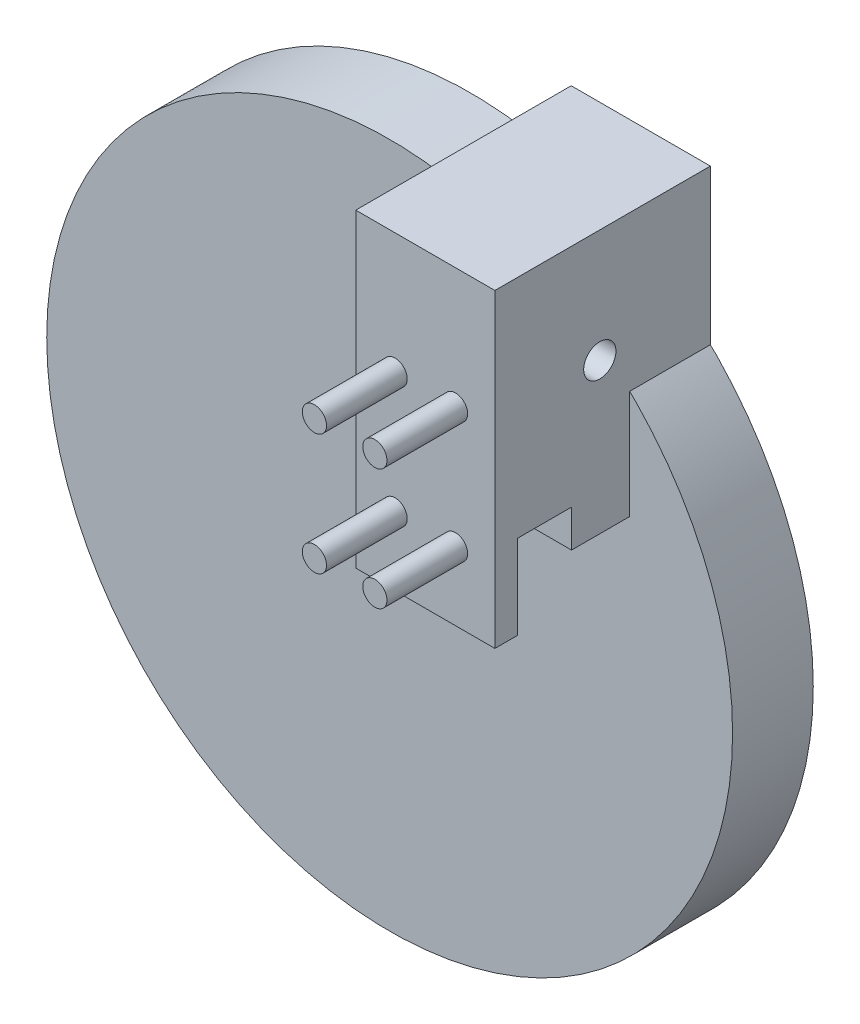
ISO-10303-21;
HEADER;
FILE_DESCRIPTION(('STEP AP214'),'2;1');
FILE_NAME('part.step','',(''),(''),'','','');
FILE_SCHEMA(('AUTOMOTIVE_DESIGN { 1 0 10303 214 1 1 1 1 }'));
ENDSEC;
DATA;
#1=APPLICATION_CONTEXT('core data for automotive mechanical design processes');
#2=APPLICATION_PROTOCOL_DEFINITION('international standard','automotive_design',2000,#1);
#3=PRODUCT_CONTEXT('',#1,'mechanical');
#4=PRODUCT('Part','Part','',(#3));
#5=PRODUCT_RELATED_PRODUCT_CATEGORY('part','',(#4));
#6=PRODUCT_DEFINITION_FORMATION('','',#4);
#7=PRODUCT_DEFINITION_CONTEXT('part definition',#1,'design');
#8=PRODUCT_DEFINITION('design','',#6,#7);
#9=PRODUCT_DEFINITION_SHAPE('','',#8);
#10=(LENGTH_UNIT() NAMED_UNIT(*) SI_UNIT(.MILLI.,.METRE.));
#11=(NAMED_UNIT(*) PLANE_ANGLE_UNIT() SI_UNIT($,.RADIAN.));
#12=(NAMED_UNIT(*) SI_UNIT($,.STERADIAN.) SOLID_ANGLE_UNIT());
#13=UNCERTAINTY_MEASURE_WITH_UNIT(LENGTH_MEASURE(1.E-05),#10,'distance_accuracy_value','');
#14=(GEOMETRIC_REPRESENTATION_CONTEXT(3) GLOBAL_UNCERTAINTY_ASSIGNED_CONTEXT((#13)) GLOBAL_UNIT_ASSIGNED_CONTEXT((#10,
#11,#12)) REPRESENTATION_CONTEXT('',''));
#15=CARTESIAN_POINT('',(0.,0.,0.));
#16=DIRECTION('',(0.,0.,1.));
#17=DIRECTION('',(1.,0.,0.));
#18=AXIS2_PLACEMENT_3D('',#15,#16,#17);
#19=CARTESIAN_POINT('',(12.5,49.5,17.2));
#20=DIRECTION('',(1.,0.,0.));
#21=DIRECTION('',(0.,1.,0.));
#22=AXIS2_PLACEMENT_3D('',#19,#20,#21);
#23=PLANE('',#22);
#24=CARTESIAN_POINT('',(12.5,35.5,13.7));
#25=DIRECTION('',(1.,0.,0.));
#26=DIRECTION('',(0.,1.,0.));
#27=AXIS2_PLACEMENT_3D('',#24,#25,#26);
#28=CIRCLE('',#27,2.);
#29=CARTESIAN_POINT('',(12.5,37.5,13.7));
#30=VERTEX_POINT('',#29);
#31=EDGE_CURVE('E261',#30,#30,#28,.F.);
#32=ORIENTED_EDGE('',*,*,#31,.F.);
#33=EDGE_LOOP('',(#32));
#34=FACE_BOUND('',#33,.T.);
#35=CARTESIAN_POINT('',(12.5,18.7225374558526,7.5));
#36=DIRECTION('',(1.,0.,0.));
#37=DIRECTION('',(0.,1.,0.));
#38=AXIS2_PLACEMENT_3D('',#35,#36,#37);
#39=CIRCLE('',#38,1.5);
#40=CARTESIAN_POINT('',(12.5,20.2225374558526,7.5));
#41=VERTEX_POINT('',#40);
#42=EDGE_CURVE('E271',#41,#41,#39,.T.);
#43=ORIENTED_EDGE('',*,*,#42,.T.);
#44=EDGE_LOOP('',(#43));
#45=FACE_BOUND('',#44,.T.);
#46=DIRECTION('',(0.,-1.,0.));
#47=VECTOR('',#46,1.);
#48=CARTESIAN_POINT('',(12.5,49.5,17.2));
#49=LINE('',#48,#47);
#50=CARTESIAN_POINT('',(12.5,21.5,17.2));
#51=VERTEX_POINT('',#50);
#52=CARTESIAN_POINT('',(12.5,16.882707638593,17.2));
#53=VERTEX_POINT('',#52);
#54=EDGE_CURVE('E265',#51,#53,#49,.T.);
#55=ORIENTED_EDGE('',*,*,#54,.F.);
#56=DIRECTION('',(0.,0.,1.));
#57=VECTOR('',#56,1.);
#58=CARTESIAN_POINT('',(12.5,21.5,17.2));
#59=LINE('',#58,#57);
#60=CARTESIAN_POINT('',(12.5,21.5,23.9));
#61=VERTEX_POINT('',#60);
#62=EDGE_CURVE('E257',#51,#61,#59,.T.);
#63=ORIENTED_EDGE('',*,*,#62,.T.);
#64=DIRECTION('',(0.,1.,0.));
#65=VECTOR('',#64,1.);
#66=CARTESIAN_POINT('',(12.5,0.,23.9));
#67=LINE('',#66,#65);
#68=CARTESIAN_POINT('',(12.5,11.0794908296356,23.9));
#69=VERTEX_POINT('',#68);
#70=EDGE_CURVE('E237',#69,#61,#67,.T.);
#71=ORIENTED_EDGE('',*,*,#70,.F.);
#72=DIRECTION('',(0.,0.,-1.));
#73=VECTOR('',#72,1.);
#74=CARTESIAN_POINT('',(12.5,11.0794908296356,0.));
#75=LINE('',#74,#73);
#76=CARTESIAN_POINT('',(12.5,11.0794908296356,26.7));
#77=VERTEX_POINT('',#76);
#78=EDGE_CURVE('E249',#77,#69,#75,.T.);
#79=ORIENTED_EDGE('',*,*,#78,.F.);
#80=DIRECTION('',(0.,1.,0.));
#81=VECTOR('',#80,1.);
#82=CARTESIAN_POINT('',(12.5,3.67961088834941,26.7));
#83=LINE('',#82,#81);
#84=CARTESIAN_POINT('',(12.5,49.5,26.7));
#85=VERTEX_POINT('',#84);
#86=EDGE_CURVE('E280',#77,#85,#83,.T.);
#87=ORIENTED_EDGE('',*,*,#86,.T.);
#88=DIRECTION('',(0.,0.,-1.));
#89=VECTOR('',#88,1.);
#90=CARTESIAN_POINT('',(12.5,49.5,17.2));
#91=LINE('',#90,#89);
#92=CARTESIAN_POINT('',(12.5,49.5,0.));
#93=VERTEX_POINT('',#92);
#94=EDGE_CURVE('E288',#85,#93,#91,.T.);
#95=ORIENTED_EDGE('',*,*,#94,.T.);
#96=DIRECTION('',(0.,-1.,0.));
#97=VECTOR('',#96,1.);
#98=CARTESIAN_POINT('',(12.5,49.5,0.));
#99=LINE('',#98,#97);
#100=CARTESIAN_POINT('',(12.5,16.882707638593,0.));
#101=VERTEX_POINT('',#100);
#102=EDGE_CURVE('E295',#93,#101,#99,.T.);
#103=ORIENTED_EDGE('',*,*,#102,.T.);
#104=DIRECTION('',(0.,0.,-1.));
#105=VECTOR('',#104,1.);
#106=CARTESIAN_POINT('',(12.5,16.882707638593,22.0126868789232));
#107=LINE('',#106,#105);
#108=EDGE_CURVE('E164',#53,#101,#107,.T.);
#109=ORIENTED_EDGE('',*,*,#108,.F.);
#110=EDGE_LOOP('',(#55,#63,#71,#79,#87,#95,#103,#109));
#111=FACE_BOUND('',#110,.T.);
#112=ADVANCED_FACE('F150',(#34,#45,#111),#23,.F.);
#113=CARTESIAN_POINT('',(29.7428613661026,49.5,17.2));
#114=DIRECTION('',(-1.,0.,0.));
#115=DIRECTION('',(0.,0.,1.));
#116=AXIS2_PLACEMENT_3D('',#113,#114,#115);
#117=PLANE('',#116);
#118=DIRECTION('',(0.,0.,-1.));
#119=VECTOR('',#118,1.);
#120=CARTESIAN_POINT('',(29.7428613661026,21.5,17.2));
#121=LINE('',#120,#119);
#122=CARTESIAN_POINT('',(29.7428613661026,21.5,23.9));
#123=VERTEX_POINT('',#122);
#124=CARTESIAN_POINT('',(29.7428613661026,21.5,17.2));
#125=VERTEX_POINT('',#124);
#126=EDGE_CURVE('E259',#123,#125,#121,.T.);
#127=ORIENTED_EDGE('',*,*,#126,.T.);
#128=DIRECTION('',(0.,1.,0.));
#129=VECTOR('',#128,1.);
#130=CARTESIAN_POINT('',(29.7428613661026,49.5,17.2));
#131=LINE('',#130,#129);
#132=CARTESIAN_POINT('',(29.7428613661026,16.882707638593,17.2));
#133=VERTEX_POINT('',#132);
#134=EDGE_CURVE('E285',#133,#125,#131,.T.);
#135=ORIENTED_EDGE('',*,*,#134,.F.);
#136=DIRECTION('',(0.,0.,1.));
#137=VECTOR('',#136,1.);
#138=CARTESIAN_POINT('',(29.7428613661026,16.882707638593,22.0126868789232));
#139=LINE('',#138,#137);
#140=CARTESIAN_POINT('',(29.7428613661026,16.882707638593,0.));
#141=VERTEX_POINT('',#140);
#142=EDGE_CURVE('E357',#141,#133,#139,.T.);
#143=ORIENTED_EDGE('',*,*,#142,.F.);
#144=DIRECTION('',(0.,1.,0.));
#145=VECTOR('',#144,1.);
#146=CARTESIAN_POINT('',(29.7428613661026,49.5,0.));
#147=LINE('',#146,#145);
#148=CARTESIAN_POINT('',(29.7428613661026,49.5,0.));
#149=VERTEX_POINT('',#148);
#150=EDGE_CURVE('E298',#141,#149,#147,.T.);
#151=ORIENTED_EDGE('',*,*,#150,.T.);
#152=DIRECTION('',(0.,0.,-1.));
#153=VECTOR('',#152,1.);
#154=CARTESIAN_POINT('',(29.7428613661026,49.5,17.2));
#155=LINE('',#154,#153);
#156=CARTESIAN_POINT('',(29.7428613661026,49.5,26.7));
#157=VERTEX_POINT('',#156);
#158=EDGE_CURVE('E305',#157,#149,#155,.T.);
#159=ORIENTED_EDGE('',*,*,#158,.F.);
#160=DIRECTION('',(0.,1.,0.));
#161=VECTOR('',#160,1.);
#162=CARTESIAN_POINT('',(29.7428613661026,3.67961088834941,26.7));
#163=LINE('',#162,#161);
#164=CARTESIAN_POINT('',(29.7428613661026,11.0794908296356,26.7));
#165=VERTEX_POINT('',#164);
#166=EDGE_CURVE('E314',#165,#157,#163,.T.);
#167=ORIENTED_EDGE('',*,*,#166,.F.);
#168=DIRECTION('',(0.,0.,1.));
#169=VECTOR('',#168,1.);
#170=CARTESIAN_POINT('',(29.7428613661026,11.0794908296356,0.));
#171=LINE('',#170,#169);
#172=CARTESIAN_POINT('',(29.7428613661026,11.0794908296356,23.9));
#173=VERTEX_POINT('',#172);
#174=EDGE_CURVE('E395',#173,#165,#171,.T.);
#175=ORIENTED_EDGE('',*,*,#174,.F.);
#176=DIRECTION('',(0.,-1.,0.));
#177=VECTOR('',#176,1.);
#178=CARTESIAN_POINT('',(29.7428613661026,0.,23.9));
#179=LINE('',#178,#177);
#180=EDGE_CURVE('E399',#123,#173,#179,.T.);
#181=ORIENTED_EDGE('',*,*,#180,.F.);
#182=EDGE_LOOP('',(#127,#135,#143,#151,#159,#167,#175,#181));
#183=FACE_BOUND('',#182,.T.);
#184=CARTESIAN_POINT('',(29.7428613661026,35.5,13.7));
#185=DIRECTION('',(1.,0.,0.));
#186=DIRECTION('',(0.,0.,-1.));
#187=AXIS2_PLACEMENT_3D('',#184,#185,#186);
#188=CIRCLE('',#187,2.);
#189=CARTESIAN_POINT('',(29.7428613661026,35.5,11.7));
#190=VERTEX_POINT('',#189);
#191=EDGE_CURVE('E368',#190,#190,#188,.T.);
#192=ORIENTED_EDGE('',*,*,#191,.F.);
#193=EDGE_LOOP('',(#192));
#194=FACE_BOUND('',#193,.T.);
#195=CARTESIAN_POINT('',(29.7428613661026,18.7225374558526,7.5));
#196=DIRECTION('',(-1.,0.,0.));
#197=DIRECTION('',(0.,0.,1.));
#198=AXIS2_PLACEMENT_3D('',#195,#196,#197);
#199=CIRCLE('',#198,1.5);
#200=CARTESIAN_POINT('',(29.7428613661026,18.7225374558526,9.));
#201=VERTEX_POINT('',#200);
#202=EDGE_CURVE('E284',#201,#201,#199,.F.);
#203=ORIENTED_EDGE('',*,*,#202,.F.);
#204=EDGE_LOOP('',(#203));
#205=FACE_BOUND('',#204,.T.);
#206=ADVANCED_FACE('F387',(#183,#194,#205),#117,.F.);
#207=CARTESIAN_POINT('',(12.5,49.5,17.2));
#208=DIRECTION('',(0.,-1.,0.));
#209=DIRECTION('',(0.,0.,-1.));
#210=AXIS2_PLACEMENT_3D('',#207,#208,#209);
#211=PLANE('',#210);
#212=ORIENTED_EDGE('',*,*,#94,.F.);
#213=DIRECTION('',(-1.,0.,0.));
#214=VECTOR('',#213,1.);
#215=CARTESIAN_POINT('',(12.5,49.5,26.7));
#216=LINE('',#215,#214);
#217=EDGE_CURVE('E260',#157,#85,#216,.T.);
#218=ORIENTED_EDGE('',*,*,#217,.F.);
#219=ORIENTED_EDGE('',*,*,#158,.T.);
#220=DIRECTION('',(-1.,0.,0.));
#221=VECTOR('',#220,1.);
#222=CARTESIAN_POINT('',(12.5,49.5,0.));
#223=LINE('',#222,#221);
#224=EDGE_CURVE('E301',#149,#93,#223,.T.);
#225=ORIENTED_EDGE('',*,*,#224,.T.);
#226=EDGE_LOOP('',(#212,#218,#219,#225));
#227=FACE_BOUND('',#226,.T.);
#228=ADVANCED_FACE('F385',(#227),#211,.F.);
#229=CARTESIAN_POINT('',(0.,0.,17.2));
#230=DIRECTION('',(0.,0.,1.));
#231=DIRECTION('',(1.,0.,0.));
#232=AXIS2_PLACEMENT_3D('',#229,#230,#231);
#233=PLANE('',#232);
#234=DIRECTION('',(-1.,0.,0.));
#235=VECTOR('',#234,1.);
#236=CARTESIAN_POINT('',(0.,16.882707638593,17.2));
#237=LINE('',#236,#235);
#238=EDGE_CURVE('E366',#133,#53,#237,.T.);
#239=ORIENTED_EDGE('',*,*,#238,.F.);
#240=ORIENTED_EDGE('',*,*,#134,.T.);
#241=DIRECTION('',(1.,0.,0.));
#242=VECTOR('',#241,1.);
#243=CARTESIAN_POINT('',(-18.804951684997,21.5,17.2));
#244=LINE('',#243,#242);
#245=EDGE_CURVE('E267',#51,#125,#244,.T.);
#246=ORIENTED_EDGE('',*,*,#245,.F.);
#247=ORIENTED_EDGE('',*,*,#54,.T.);
#248=EDGE_LOOP('',(#239,#240,#246,#247));
#249=FACE_BOUND('',#248,.T.);
#250=ADVANCED_FACE('F398',(#249),#233,.T.);
#251=CARTESIAN_POINT('',(0.,0.,0.));
#252=DIRECTION('',(0.,0.,1.));
#253=DIRECTION('',(1.,0.,0.));
#254=AXIS2_PLACEMENT_3D('',#251,#252,#253);
#255=PLANE('',#254);
#256=ORIENTED_EDGE('',*,*,#150,.F.);
#257=DIRECTION('',(-1.,0.,0.));
#258=VECTOR('',#257,1.);
#259=CARTESIAN_POINT('',(0.,16.882707638593,0.));
#260=LINE('',#259,#258);
#261=EDGE_CURVE('E364',#141,#101,#260,.T.);
#262=ORIENTED_EDGE('',*,*,#261,.T.);
#263=ORIENTED_EDGE('',*,*,#102,.F.);
#264=ORIENTED_EDGE('',*,*,#224,.F.);
#265=EDGE_LOOP('',(#256,#262,#263,#264));
#266=FACE_BOUND('',#265,.T.);
#267=ADVANCED_FACE('F393',(#266),#255,.F.);
#268=CARTESIAN_POINT('',(34.7428613661026,18.7225374558526,7.5));
#269=DIRECTION('',(-1.,0.,0.));
#270=DIRECTION('',(0.,0.,1.));
#271=AXIS2_PLACEMENT_3D('',#268,#269,#270);
#272=CYLINDRICAL_SURFACE('',#271,1.5);
#273=CARTESIAN_POINT('',(34.7428613661026,18.7225374558526,7.5));
#274=DIRECTION('',(1.,0.,0.));
#275=DIRECTION('',(0.,0.,-1.));
#276=AXIS2_PLACEMENT_3D('',#273,#274,#275);
#277=CIRCLE('',#276,1.5);
#278=CARTESIAN_POINT('',(34.7428613661026,18.7225374558526,6.));
#279=VERTEX_POINT('',#278);
#280=EDGE_CURVE('E318',#279,#279,#277,.T.);
#281=ORIENTED_EDGE('',*,*,#280,.F.);
#282=EDGE_LOOP('',(#281));
#283=FACE_BOUND('',#282,.T.);
#284=ORIENTED_EDGE('',*,*,#202,.T.);
#285=EDGE_LOOP('',(#284));
#286=FACE_BOUND('',#285,.T.);
#287=ADVANCED_FACE('F447',(#283,#286),#272,.T.);
#288=CARTESIAN_POINT('',(34.7428613661026,18.7225374558526,7.5));
#289=DIRECTION('',(1.,0.,0.));
#290=DIRECTION('',(0.,0.,-1.));
#291=AXIS2_PLACEMENT_3D('',#288,#289,#290);
#292=PLANE('',#291);
#293=ORIENTED_EDGE('',*,*,#280,.T.);
#294=EDGE_LOOP('',(#293));
#295=FACE_BOUND('',#294,.T.);
#296=ADVANCED_FACE('F433',(#295),#292,.T.);
#297=CARTESIAN_POINT('',(12.5,18.7225374558526,7.5));
#298=DIRECTION('',(1.,0.,0.));
#299=DIRECTION('',(0.,1.,0.));
#300=AXIS2_PLACEMENT_3D('',#297,#298,#299);
#301=CYLINDRICAL_SURFACE('',#300,1.5);
#302=CARTESIAN_POINT('',(7.50000000000001,18.7225374558526,7.5));
#303=DIRECTION('',(1.,0.,0.));
#304=DIRECTION('',(0.,1.,0.));
#305=AXIS2_PLACEMENT_3D('',#302,#303,#304);
#306=CIRCLE('',#305,1.5);
#307=CARTESIAN_POINT('',(7.50000000000001,20.2225374558526,7.5));
#308=VERTEX_POINT('',#307);
#309=EDGE_CURVE('E266',#308,#308,#306,.T.);
#310=CARTESIAN_POINT('',(12.5,20.2225374558526,7.5));
#311=CARTESIAN_POINT('',(12.4479166666667,20.2225374558526,7.5));
#312=CARTESIAN_POINT('',(12.3958333333333,20.2225374558526,7.5));
#313=CARTESIAN_POINT('',(12.2916666666667,20.2225374558526,7.5));
#314=CARTESIAN_POINT('',(12.2395833333333,20.2225374558526,7.5));
#315=CARTESIAN_POINT('',(12.1354166666667,20.2225374558526,7.5));
#316=CARTESIAN_POINT('',(12.0833333333333,20.2225374558526,7.5));
#317=CARTESIAN_POINT('',(11.9791666666667,20.2225374558526,7.5));
#318=CARTESIAN_POINT('',(11.9270833333333,20.2225374558526,7.5));
#319=CARTESIAN_POINT('',(11.8229166666667,20.2225374558526,7.5));
#320=CARTESIAN_POINT('',(11.7708333333333,20.2225374558526,7.5));
#321=CARTESIAN_POINT('',(11.6666666666667,20.2225374558526,7.5));
#322=CARTESIAN_POINT('',(11.6145833333333,20.2225374558526,7.5));
#323=CARTESIAN_POINT('',(11.5104166666667,20.2225374558526,7.5));
#324=CARTESIAN_POINT('',(11.4583333333333,20.2225374558526,7.5));
#325=CARTESIAN_POINT('',(11.3541666666667,20.2225374558526,7.5));
#326=CARTESIAN_POINT('',(11.3020833333333,20.2225374558526,7.5));
#327=CARTESIAN_POINT('',(11.1979166666667,20.2225374558526,7.5));
#328=CARTESIAN_POINT('',(11.1458333333333,20.2225374558526,7.5));
#329=CARTESIAN_POINT('',(11.0416666666667,20.2225374558526,7.5));
#330=CARTESIAN_POINT('',(10.9895833333333,20.2225374558526,7.5));
#331=CARTESIAN_POINT('',(10.8854166666667,20.2225374558526,7.5));
#332=CARTESIAN_POINT('',(10.8333333333333,20.2225374558526,7.5));
#333=CARTESIAN_POINT('',(10.7291666666667,20.2225374558526,7.5));
#334=CARTESIAN_POINT('',(10.6770833333333,20.2225374558526,7.5));
#335=CARTESIAN_POINT('',(10.5729166666667,20.2225374558526,7.5));
#336=CARTESIAN_POINT('',(10.5208333333333,20.2225374558526,7.5));
#337=CARTESIAN_POINT('',(10.4166666666667,20.2225374558526,7.5));
#338=CARTESIAN_POINT('',(10.3645833333333,20.2225374558526,7.5));
#339=CARTESIAN_POINT('',(10.2604166666667,20.2225374558526,7.5));
#340=CARTESIAN_POINT('',(10.2083333333333,20.2225374558526,7.5));
#341=CARTESIAN_POINT('',(10.1041666666667,20.2225374558526,7.5));
#342=CARTESIAN_POINT('',(10.0520833333333,20.2225374558526,7.5));
#343=CARTESIAN_POINT('',(9.94791666666667,20.2225374558526,7.5));
#344=CARTESIAN_POINT('',(9.89583333333334,20.2225374558526,7.5));
#345=CARTESIAN_POINT('',(9.79166666666667,20.2225374558526,7.5));
#346=CARTESIAN_POINT('',(9.73958333333334,20.2225374558526,7.5));
#347=CARTESIAN_POINT('',(9.63541666666667,20.2225374558526,7.5));
#348=CARTESIAN_POINT('',(9.58333333333334,20.2225374558526,7.5));
#349=CARTESIAN_POINT('',(9.47916666666667,20.2225374558526,7.5));
#350=CARTESIAN_POINT('',(9.42708333333334,20.2225374558526,7.5));
#351=CARTESIAN_POINT('',(9.32291666666667,20.2225374558526,7.5));
#352=CARTESIAN_POINT('',(9.27083333333334,20.2225374558526,7.5));
#353=CARTESIAN_POINT('',(9.16666666666667,20.2225374558526,7.5));
#354=CARTESIAN_POINT('',(9.11458333333334,20.2225374558526,7.5));
#355=CARTESIAN_POINT('',(9.01041666666667,20.2225374558526,7.5));
#356=CARTESIAN_POINT('',(8.95833333333334,20.2225374558526,7.5));
#357=CARTESIAN_POINT('',(8.85416666666667,20.2225374558526,7.5));
#358=CARTESIAN_POINT('',(8.80208333333334,20.2225374558526,7.5));
#359=CARTESIAN_POINT('',(8.69791666666667,20.2225374558526,7.5));
#360=CARTESIAN_POINT('',(8.64583333333334,20.2225374558526,7.5));
#361=CARTESIAN_POINT('',(8.54166666666667,20.2225374558526,7.5));
#362=CARTESIAN_POINT('',(8.48958333333334,20.2225374558526,7.5));
#363=CARTESIAN_POINT('',(8.38541666666667,20.2225374558526,7.5));
#364=CARTESIAN_POINT('',(8.33333333333334,20.2225374558526,7.5));
#365=CARTESIAN_POINT('',(8.22916666666667,20.2225374558526,7.5));
#366=CARTESIAN_POINT('',(8.17708333333334,20.2225374558526,7.5));
#367=CARTESIAN_POINT('',(8.07291666666667,20.2225374558526,7.5));
#368=CARTESIAN_POINT('',(8.02083333333334,20.2225374558526,7.5));
#369=CARTESIAN_POINT('',(7.91666666666667,20.2225374558526,7.5));
#370=CARTESIAN_POINT('',(7.86458333333334,20.2225374558526,7.5));
#371=CARTESIAN_POINT('',(7.76041666666667,20.2225374558526,7.5));
#372=CARTESIAN_POINT('',(7.70833333333334,20.2225374558526,7.5));
#373=CARTESIAN_POINT('',(7.60416666666667,20.2225374558526,7.5));
#374=CARTESIAN_POINT('',(7.55208333333334,20.2225374558526,7.5));
#375=CARTESIAN_POINT('',(7.50000000000001,20.2225374558526,7.5));
#376=B_SPLINE_CURVE_WITH_KNOTS('',3,(#310,#311,#312,#313,#314,#315,#316,#317,#318,#319,#320,
#321,#322,#323,#324,#325,#326,#327,#328,#329,#330,#331,#332,#333,#334,#335,#336,#337,#338,#339,
#340,#341,#342,#343,#344,#345,#346,#347,#348,#349,#350,#351,#352,#353,#354,#355,#356,#357,#358,
#359,#360,#361,#362,#363,#364,#365,#366,#367,#368,#369,#370,#371,#372,#373,#374,#375),
.UNSPECIFIED.,.F.,.F.,(4,2,2,2,2,2,2,2,2,2,2,2,2,2,2,2,2,2,2,2,2,2,2,2,2,2,2,2,2,2,2,2,4),(0.,
0.156249999999998,0.312499999999999,0.468749999999999,0.624999999999999,0.781249999999999,
0.937499999999999,1.09375,1.25,1.40625,1.5625,1.71875,1.875,2.03125,2.1875,2.34375,2.5,2.65625,
2.8125,2.96875,3.125,3.28125,3.4375,3.59375,3.75,3.90625,4.0625,4.21875,4.375,4.53125,4.6875,
4.84375,5.),.UNSPECIFIED.);
#377=EDGE_CURVE('BSEAM429',#41,#308,#376,.T.);
#378=ORIENTED_EDGE('',*,*,#42,.F.);
#379=ORIENTED_EDGE('',*,*,#309,.T.);
#380=ORIENTED_EDGE('',*,*,#377,.T.);
#381=ORIENTED_EDGE('',*,*,#377,.F.);
#382=EDGE_LOOP('',(#378,#380,#379,#381));
#383=FACE_BOUND('',#382,.T.);
#384=ADVANCED_FACE('F429',(#383),#301,.T.);
#385=CARTESIAN_POINT('',(7.5,49.5,17.2));
#386=DIRECTION('',(1.,0.,0.));
#387=DIRECTION('',(0.,1.,0.));
#388=AXIS2_PLACEMENT_3D('',#385,#386,#387);
#389=PLANE('',#388);
#390=ORIENTED_EDGE('',*,*,#309,.F.);
#391=EDGE_LOOP('',(#390));
#392=FACE_BOUND('',#391,.T.);
#393=ADVANCED_FACE('F432',(#392),#389,.F.);
#394=CARTESIAN_POINT('',(-18.804951684997,21.5,17.2));
#395=DIRECTION('',(0.,-1.,0.));
#396=DIRECTION('',(0.,0.,-1.));
#397=AXIS2_PLACEMENT_3D('',#394,#395,#396);
#398=PLANE('',#397);
#399=DIRECTION('',(1.,0.,0.));
#400=VECTOR('',#399,1.);
#401=CARTESIAN_POINT('',(-18.804951684997,21.5,23.9));
#402=LINE('',#401,#400);
#403=EDGE_CURVE('E241',#61,#123,#402,.T.);
#404=ORIENTED_EDGE('',*,*,#403,.F.);
#405=ORIENTED_EDGE('',*,*,#62,.F.);
#406=ORIENTED_EDGE('',*,*,#245,.T.);
#407=ORIENTED_EDGE('',*,*,#126,.F.);
#408=EDGE_LOOP('',(#404,#405,#406,#407));
#409=FACE_BOUND('',#408,.T.);
#410=ADVANCED_FACE('F255',(#409),#398,.T.);
#411=CARTESIAN_POINT('',(12.5,3.67961088834941,26.7));
#412=DIRECTION('',(0.,0.,-1.));
#413=DIRECTION('',(-1.,0.,0.));
#414=AXIS2_PLACEMENT_3D('',#411,#412,#413);
#415=PLANE('',#414);
#416=CARTESIAN_POINT('',(17.3764124998598,34.5606247176545,26.7));
#417=DIRECTION('',(0.,0.,-1.));
#418=DIRECTION('',(-1.,0.,0.));
#419=AXIS2_PLACEMENT_3D('',#416,#417,#418);
#420=CIRCLE('',#419,1.5);
#421=CARTESIAN_POINT('',(15.8764124998598,34.5606247176545,26.7));
#422=VERTEX_POINT('',#421);
#423=EDGE_CURVE('E14',#422,#422,#420,.F.);
#424=ORIENTED_EDGE('',*,*,#423,.F.);
#425=EDGE_LOOP('',(#424));
#426=FACE_BOUND('',#425,.T.);
#427=CARTESIAN_POINT('',(24.8664488662428,34.5606247176545,26.7));
#428=DIRECTION('',(0.,0.,-1.));
#429=DIRECTION('',(-1.,0.,0.));
#430=AXIS2_PLACEMENT_3D('',#427,#428,#429);
#431=CIRCLE('',#430,1.5);
#432=CARTESIAN_POINT('',(23.3664488662428,34.5606247176545,26.7));
#433=VERTEX_POINT('',#432);
#434=EDGE_CURVE('E157',#433,#433,#431,.F.);
#435=ORIENTED_EDGE('',*,*,#434,.F.);
#436=EDGE_LOOP('',(#435));
#437=FACE_BOUND('',#436,.T.);
#438=CARTESIAN_POINT('',(17.3764124998598,19.5606247176545,26.7));
#439=DIRECTION('',(0.,0.,-1.));
#440=DIRECTION('',(-1.,0.,0.));
#441=AXIS2_PLACEMENT_3D('',#438,#439,#440);
#442=CIRCLE('',#441,1.5);
#443=CARTESIAN_POINT('',(15.8764124998598,19.5606247176545,26.7));
#444=VERTEX_POINT('',#443);
#445=EDGE_CURVE('E702',#444,#444,#442,.F.);
#446=ORIENTED_EDGE('',*,*,#445,.F.);
#447=EDGE_LOOP('',(#446));
#448=FACE_BOUND('',#447,.T.);
#449=CARTESIAN_POINT('',(24.8664488662428,19.5606247176545,26.7));
#450=DIRECTION('',(0.,0.,-1.));
#451=DIRECTION('',(-1.,0.,0.));
#452=AXIS2_PLACEMENT_3D('',#449,#450,#451);
#453=CIRCLE('',#452,1.5);
#454=CARTESIAN_POINT('',(23.3664488662428,19.5606247176545,26.7));
#455=VERTEX_POINT('',#454);
#456=EDGE_CURVE('E283',#455,#455,#453,.F.);
#457=ORIENTED_EDGE('',*,*,#456,.F.);
#458=EDGE_LOOP('',(#457));
#459=FACE_BOUND('',#458,.T.);
#460=ORIENTED_EDGE('',*,*,#166,.T.);
#461=ORIENTED_EDGE('',*,*,#217,.T.);
#462=ORIENTED_EDGE('',*,*,#86,.F.);
#463=DIRECTION('',(-1.,0.,0.));
#464=VECTOR('',#463,1.);
#465=CARTESIAN_POINT('',(68.8483201799726,11.0794908296356,26.7));
#466=LINE('',#465,#464);
#467=EDGE_CURVE('E380',#165,#77,#466,.T.);
#468=ORIENTED_EDGE('',*,*,#467,.F.);
#469=EDGE_LOOP('',(#460,#461,#462,#468));
#470=FACE_BOUND('',#469,.T.);
#471=ADVANCED_FACE('F378',(#426,#437,#448,#459,#470),#415,.F.);
#472=CARTESIAN_POINT('',(6.84314575050763,35.5,13.7));
#473=DIRECTION('',(1.,0.,0.));
#474=DIRECTION('',(0.,1.,0.));
#475=AXIS2_PLACEMENT_3D('',#472,#473,#474);
#476=CYLINDRICAL_SURFACE('',#475,2.);
#477=ORIENTED_EDGE('',*,*,#31,.T.);
#478=EDGE_LOOP('',(#477));
#479=FACE_BOUND('',#478,.T.);
#480=ORIENTED_EDGE('',*,*,#191,.T.);
#481=EDGE_LOOP('',(#480));
#482=FACE_BOUND('',#481,.T.);
#483=ADVANCED_FACE('F539',(#479,#482),#476,.F.);
#484=CARTESIAN_POINT('',(58.3141817209626,16.882707638593,22.0126868789232));
#485=DIRECTION('',(0.,1.,0.));
#486=DIRECTION('',(-1.,0.,0.));
#487=AXIS2_PLACEMENT_3D('',#484,#485,#486);
#488=PLANE('',#487);
#489=ORIENTED_EDGE('',*,*,#238,.T.);
#490=ORIENTED_EDGE('',*,*,#108,.T.);
#491=ORIENTED_EDGE('',*,*,#261,.F.);
#492=ORIENTED_EDGE('',*,*,#142,.T.);
#493=EDGE_LOOP('',(#489,#490,#491,#492));
#494=FACE_BOUND('',#493,.T.);
#495=DIRECTION('',(0.,0.,1.));
#496=VECTOR('',#495,1.);
#497=CARTESIAN_POINT('',(27.7428613661026,16.882707638593,15.2));
#498=LINE('',#497,#496);
#499=CARTESIAN_POINT('',(27.7428613661026,16.882707638593,2.));
#500=VERTEX_POINT('',#499);
#501=CARTESIAN_POINT('',(27.7428613661026,16.882707638593,15.2));
#502=VERTEX_POINT('',#501);
#503=EDGE_CURVE('E281',#500,#502,#498,.T.);
#504=ORIENTED_EDGE('',*,*,#503,.F.);
#505=DIRECTION('',(1.,0.,0.));
#506=VECTOR('',#505,1.);
#507=CARTESIAN_POINT('',(14.5,16.882707638593,2.));
#508=LINE('',#507,#506);
#509=CARTESIAN_POINT('',(14.5,16.882707638593,2.));
#510=VERTEX_POINT('',#509);
#511=EDGE_CURVE('E351',#510,#500,#508,.T.);
#512=ORIENTED_EDGE('',*,*,#511,.F.);
#513=DIRECTION('',(0.,0.,-1.));
#514=VECTOR('',#513,1.);
#515=CARTESIAN_POINT('',(14.5,16.882707638593,15.2));
#516=LINE('',#515,#514);
#517=CARTESIAN_POINT('',(14.5,16.882707638593,15.2));
#518=VERTEX_POINT('',#517);
#519=EDGE_CURVE('E356',#518,#510,#516,.T.);
#520=ORIENTED_EDGE('',*,*,#519,.F.);
#521=DIRECTION('',(-1.,0.,0.));
#522=VECTOR('',#521,1.);
#523=CARTESIAN_POINT('',(14.5,16.882707638593,15.2));
#524=LINE('',#523,#522);
#525=EDGE_CURVE('E172',#502,#518,#524,.T.);
#526=ORIENTED_EDGE('',*,*,#525,.F.);
#527=EDGE_LOOP('',(#504,#512,#520,#526));
#528=FACE_BOUND('',#527,.T.);
#529=ADVANCED_FACE('F350',(#494,#528),#488,.F.);
#530=CARTESIAN_POINT('',(0.,30.,0.));
#531=DIRECTION('',(0.,-1.,0.));
#532=DIRECTION('',(0.,0.,-1.));
#533=AXIS2_PLACEMENT_3D('',#530,#531,#532);
#534=PLANE('',#533);
#535=DIRECTION('',(0.,0.,1.));
#536=VECTOR('',#535,1.);
#537=CARTESIAN_POINT('',(27.7428613661026,30.,15.2));
#538=LINE('',#537,#536);
#539=CARTESIAN_POINT('',(27.7428613661026,30.,2.));
#540=VERTEX_POINT('',#539);
#541=CARTESIAN_POINT('',(27.7428613661026,30.,15.2));
#542=VERTEX_POINT('',#541);
#543=EDGE_CURVE('E322',#540,#542,#538,.T.);
#544=ORIENTED_EDGE('',*,*,#543,.T.);
#545=DIRECTION('',(-1.,0.,0.));
#546=VECTOR('',#545,1.);
#547=CARTESIAN_POINT('',(14.5,30.,15.2));
#548=LINE('',#547,#546);
#549=CARTESIAN_POINT('',(14.5,30.,15.2));
#550=VERTEX_POINT('',#549);
#551=EDGE_CURVE('E325',#542,#550,#548,.T.);
#552=ORIENTED_EDGE('',*,*,#551,.T.);
#553=DIRECTION('',(0.,0.,-1.));
#554=VECTOR('',#553,1.);
#555=CARTESIAN_POINT('',(14.5,30.,15.2));
#556=LINE('',#555,#554);
#557=CARTESIAN_POINT('',(14.5,30.,2.));
#558=VERTEX_POINT('',#557);
#559=EDGE_CURVE('E328',#550,#558,#556,.T.);
#560=ORIENTED_EDGE('',*,*,#559,.T.);
#561=DIRECTION('',(1.,0.,0.));
#562=VECTOR('',#561,1.);
#563=CARTESIAN_POINT('',(14.5,30.,2.));
#564=LINE('',#563,#562);
#565=EDGE_CURVE('E331',#558,#540,#564,.T.);
#566=ORIENTED_EDGE('',*,*,#565,.T.);
#567=EDGE_LOOP('',(#544,#552,#560,#566));
#568=FACE_BOUND('',#567,.T.);
#569=ADVANCED_FACE('F452',(#568),#534,.T.);
#570=CARTESIAN_POINT('',(27.7428613661026,30.,15.2));
#571=DIRECTION('',(1.,0.,0.));
#572=DIRECTION('',(0.,0.,-1.));
#573=AXIS2_PLACEMENT_3D('',#570,#571,#572);
#574=PLANE('',#573);
#575=DIRECTION('',(0.,-1.,0.));
#576=VECTOR('',#575,1.);
#577=CARTESIAN_POINT('',(27.7428613661026,30.,2.));
#578=LINE('',#577,#576);
#579=EDGE_CURVE('E299',#540,#500,#578,.T.);
#580=ORIENTED_EDGE('',*,*,#579,.T.);
#581=ORIENTED_EDGE('',*,*,#503,.T.);
#582=DIRECTION('',(0.,-1.,0.));
#583=VECTOR('',#582,1.);
#584=CARTESIAN_POINT('',(27.7428613661026,30.,15.2));
#585=LINE('',#584,#583);
#586=EDGE_CURVE('E334',#542,#502,#585,.T.);
#587=ORIENTED_EDGE('',*,*,#586,.F.);
#588=ORIENTED_EDGE('',*,*,#543,.F.);
#589=EDGE_LOOP('',(#580,#581,#587,#588));
#590=FACE_BOUND('',#589,.T.);
#591=ADVANCED_FACE('F348',(#590),#574,.F.);
#592=CARTESIAN_POINT('',(14.5,30.,2.));
#593=DIRECTION('',(0.,0.,-1.));
#594=DIRECTION('',(-1.,0.,0.));
#595=AXIS2_PLACEMENT_3D('',#592,#593,#594);
#596=PLANE('',#595);
#597=DIRECTION('',(0.,-1.,0.));
#598=VECTOR('',#597,1.);
#599=CARTESIAN_POINT('',(14.5,30.,2.));
#600=LINE('',#599,#598);
#601=EDGE_CURVE('E337',#558,#510,#600,.T.);
#602=ORIENTED_EDGE('',*,*,#601,.T.);
#603=ORIENTED_EDGE('',*,*,#511,.T.);
#604=ORIENTED_EDGE('',*,*,#579,.F.);
#605=ORIENTED_EDGE('',*,*,#565,.F.);
#606=EDGE_LOOP('',(#602,#603,#604,#605));
#607=FACE_BOUND('',#606,.T.);
#608=ADVANCED_FACE('F354',(#607),#596,.F.);
#609=CARTESIAN_POINT('',(14.5,30.,15.2));
#610=DIRECTION('',(-1.,0.,0.));
#611=DIRECTION('',(0.,0.,1.));
#612=AXIS2_PLACEMENT_3D('',#609,#610,#611);
#613=PLANE('',#612);
#614=DIRECTION('',(0.,-1.,0.));
#615=VECTOR('',#614,1.);
#616=CARTESIAN_POINT('',(14.5,30.,15.2));
#617=LINE('',#616,#615);
#618=EDGE_CURVE('E340',#550,#518,#617,.T.);
#619=ORIENTED_EDGE('',*,*,#618,.T.);
#620=ORIENTED_EDGE('',*,*,#519,.T.);
#621=ORIENTED_EDGE('',*,*,#601,.F.);
#622=ORIENTED_EDGE('',*,*,#559,.F.);
#623=EDGE_LOOP('',(#619,#620,#621,#622));
#624=FACE_BOUND('',#623,.T.);
#625=ADVANCED_FACE('F417',(#624),#613,.F.);
#626=CARTESIAN_POINT('',(14.5,30.,15.2));
#627=DIRECTION('',(0.,0.,1.));
#628=DIRECTION('',(1.,0.,0.));
#629=AXIS2_PLACEMENT_3D('',#626,#627,#628);
#630=PLANE('',#629);
#631=ORIENTED_EDGE('',*,*,#586,.T.);
#632=ORIENTED_EDGE('',*,*,#525,.T.);
#633=ORIENTED_EDGE('',*,*,#618,.F.);
#634=ORIENTED_EDGE('',*,*,#551,.F.);
#635=EDGE_LOOP('',(#631,#632,#633,#634));
#636=FACE_BOUND('',#635,.T.);
#637=ADVANCED_FACE('F345',(#636),#630,.F.);
#638=CARTESIAN_POINT('',(68.8483201799726,11.0794908296356,0.));
#639=DIRECTION('',(0.,1.,0.));
#640=DIRECTION('',(-1.,0.,0.));
#641=AXIS2_PLACEMENT_3D('',#638,#639,#640);
#642=PLANE('',#641);
#643=DIRECTION('',(-1.,0.,0.));
#644=VECTOR('',#643,1.);
#645=CARTESIAN_POINT('',(68.8483201799726,11.0794908296356,23.9));
#646=LINE('',#645,#644);
#647=EDGE_CURVE('E244',#173,#69,#646,.T.);
#648=ORIENTED_EDGE('',*,*,#647,.F.);
#649=ORIENTED_EDGE('',*,*,#174,.T.);
#650=ORIENTED_EDGE('',*,*,#467,.T.);
#651=ORIENTED_EDGE('',*,*,#78,.T.);
#652=EDGE_LOOP('',(#648,#649,#650,#651));
#653=FACE_BOUND('',#652,.T.);
#654=ADVANCED_FACE('F408',(#653),#642,.F.);
#655=CARTESIAN_POINT('',(68.8483201799726,0.,23.9));
#656=DIRECTION('',(0.,0.,1.));
#657=DIRECTION('',(1.,0.,0.));
#658=AXIS2_PLACEMENT_3D('',#655,#656,#657);
#659=PLANE('',#658);
#660=ORIENTED_EDGE('',*,*,#403,.T.);
#661=ORIENTED_EDGE('',*,*,#180,.T.);
#662=ORIENTED_EDGE('',*,*,#647,.T.);
#663=ORIENTED_EDGE('',*,*,#70,.T.);
#664=EDGE_LOOP('',(#660,#661,#662,#663));
#665=FACE_BOUND('',#664,.T.);
#666=ADVANCED_FACE('F239',(#665),#659,.F.);
#667=CARTESIAN_POINT('',(24.8664488662428,19.5606247176545,36.7));
#668=DIRECTION('',(0.,0.,-1.));
#669=DIRECTION('',(-1.,0.,0.));
#670=AXIS2_PLACEMENT_3D('',#667,#668,#669);
#671=CYLINDRICAL_SURFACE('',#670,1.5);
#672=CARTESIAN_POINT('',(24.8664488662428,19.5606247176545,36.7));
#673=DIRECTION('',(0.,0.,1.));
#674=DIRECTION('',(1.,0.,0.));
#675=AXIS2_PLACEMENT_3D('',#672,#673,#674);
#676=CIRCLE('',#675,1.5);
#677=CARTESIAN_POINT('',(26.3664488662428,19.5606247176545,36.7));
#678=VERTEX_POINT('',#677);
#679=EDGE_CURVE('E250',#678,#678,#676,.T.);
#680=ORIENTED_EDGE('',*,*,#679,.F.);
#681=EDGE_LOOP('',(#680));
#682=FACE_BOUND('',#681,.T.);
#683=ORIENTED_EDGE('',*,*,#456,.T.);
#684=EDGE_LOOP('',(#683));
#685=FACE_BOUND('',#684,.T.);
#686=ADVANCED_FACE('F415',(#682,#685),#671,.T.);
#687=CARTESIAN_POINT('',(24.8664488662428,19.5606247176545,36.7));
#688=DIRECTION('',(0.,0.,1.));
#689=DIRECTION('',(1.,0.,0.));
#690=AXIS2_PLACEMENT_3D('',#687,#688,#689);
#691=PLANE('',#690);
#692=ORIENTED_EDGE('',*,*,#679,.T.);
#693=EDGE_LOOP('',(#692));
#694=FACE_BOUND('',#693,.T.);
#695=ADVANCED_FACE('F613',(#694),#691,.T.);
#696=CARTESIAN_POINT('',(17.3764124998598,19.5606247176545,36.7));
#697=DIRECTION('',(0.,0.,-1.));
#698=DIRECTION('',(-1.,0.,0.));
#699=AXIS2_PLACEMENT_3D('',#696,#697,#698);
#700=CYLINDRICAL_SURFACE('',#699,1.5);
#701=CARTESIAN_POINT('',(17.3764124998598,19.5606247176545,36.7));
#702=DIRECTION('',(0.,0.,1.));
#703=DIRECTION('',(-1.,0.,0.));
#704=AXIS2_PLACEMENT_3D('',#701,#702,#703);
#705=CIRCLE('',#704,1.5);
#706=CARTESIAN_POINT('',(15.8764124998598,19.5606247176545,36.7));
#707=VERTEX_POINT('',#706);
#708=EDGE_CURVE('E692',#707,#707,#705,.T.);
#709=ORIENTED_EDGE('',*,*,#708,.F.);
#710=EDGE_LOOP('',(#709));
#711=FACE_BOUND('',#710,.T.);
#712=ORIENTED_EDGE('',*,*,#445,.T.);
#713=EDGE_LOOP('',(#712));
#714=FACE_BOUND('',#713,.T.);
#715=ADVANCED_FACE('F622',(#711,#714),#700,.T.);
#716=CARTESIAN_POINT('',(17.3764124998598,19.5606247176545,36.7));
#717=DIRECTION('',(0.,0.,-1.));
#718=DIRECTION('',(-1.,0.,0.));
#719=AXIS2_PLACEMENT_3D('',#716,#717,#718);
#720=PLANE('',#719);
#721=ORIENTED_EDGE('',*,*,#708,.T.);
#722=EDGE_LOOP('',(#721));
#723=FACE_BOUND('',#722,.T.);
#724=ADVANCED_FACE('F632',(#723),#720,.F.);
#725=CARTESIAN_POINT('',(24.8664488662428,34.5606247176545,36.7));
#726=DIRECTION('',(0.,0.,-1.));
#727=DIRECTION('',(-1.,0.,0.));
#728=AXIS2_PLACEMENT_3D('',#725,#726,#727);
#729=CYLINDRICAL_SURFACE('',#728,1.5);
#730=CARTESIAN_POINT('',(24.8664488662428,34.5606247176545,36.7));
#731=DIRECTION('',(0.,0.,1.));
#732=DIRECTION('',(1.,0.,0.));
#733=AXIS2_PLACEMENT_3D('',#730,#731,#732);
#734=CIRCLE('',#733,1.5);
#735=CARTESIAN_POINT('',(26.3664488662428,34.5606247176545,36.7));
#736=VERTEX_POINT('',#735);
#737=EDGE_CURVE('E689',#736,#736,#734,.T.);
#738=ORIENTED_EDGE('',*,*,#737,.F.);
#739=EDGE_LOOP('',(#738));
#740=FACE_BOUND('',#739,.T.);
#741=ORIENTED_EDGE('',*,*,#434,.T.);
#742=EDGE_LOOP('',(#741));
#743=FACE_BOUND('',#742,.T.);
#744=ADVANCED_FACE('F642',(#740,#743),#729,.T.);
#745=CARTESIAN_POINT('',(24.8664488662428,34.5606247176545,36.7));
#746=DIRECTION('',(0.,0.,1.));
#747=DIRECTION('',(1.,0.,0.));
#748=AXIS2_PLACEMENT_3D('',#745,#746,#747);
#749=PLANE('',#748);
#750=ORIENTED_EDGE('',*,*,#737,.T.);
#751=EDGE_LOOP('',(#750));
#752=FACE_BOUND('',#751,.T.);
#753=ADVANCED_FACE('F652',(#752),#749,.T.);
#754=CARTESIAN_POINT('',(17.3764124998598,34.5606247176545,36.7));
#755=DIRECTION('',(0.,0.,-1.));
#756=DIRECTION('',(-1.,0.,0.));
#757=AXIS2_PLACEMENT_3D('',#754,#755,#756);
#758=CYLINDRICAL_SURFACE('',#757,1.5);
#759=CARTESIAN_POINT('',(17.3764124998598,34.5606247176545,36.7));
#760=DIRECTION('',(0.,0.,1.));
#761=DIRECTION('',(-1.,0.,0.));
#762=AXIS2_PLACEMENT_3D('',#759,#760,#761);
#763=CIRCLE('',#762,1.5);
#764=CARTESIAN_POINT('',(15.8764124998598,34.5606247176545,36.7));
#765=VERTEX_POINT('',#764);
#766=EDGE_CURVE('E688',#765,#765,#763,.T.);
#767=ORIENTED_EDGE('',*,*,#766,.F.);
#768=EDGE_LOOP('',(#767));
#769=FACE_BOUND('',#768,.T.);
#770=ORIENTED_EDGE('',*,*,#423,.T.);
#771=EDGE_LOOP('',(#770));
#772=FACE_BOUND('',#771,.T.);
#773=ADVANCED_FACE('F662',(#769,#772),#758,.T.);
#774=CARTESIAN_POINT('',(17.3764124998598,34.5606247176545,36.7));
#775=DIRECTION('',(0.,0.,-1.));
#776=DIRECTION('',(-1.,0.,0.));
#777=AXIS2_PLACEMENT_3D('',#774,#775,#776);
#778=PLANE('',#777);
#779=ORIENTED_EDGE('',*,*,#766,.T.);
#780=EDGE_LOOP('',(#779));
#781=FACE_BOUND('',#780,.T.);
#782=ADVANCED_FACE('F672',(#781),#778,.F.);
#783=CLOSED_SHELL('',(#112,#206,#228,#250,#267,#287,#296,#384,#393,#410,#471,#483,#529,#569,
#591,#608,#625,#637,#654,#666,#686,#695,#715,#724,#744,#753,#773,#782));
#784=MANIFOLD_SOLID_BREP('B2',#783);
#785=CARTESIAN_POINT('',(0.,0.,10.));
#786=DIRECTION('',(0.,0.,-1.));
#787=DIRECTION('',(-1.,0.,0.));
#788=AXIS2_PLACEMENT_3D('',#785,#786,#787);
#789=CYLINDRICAL_SURFACE('',#788,42.5);
#790=CARTESIAN_POINT('',(0.,0.,10.));
#791=DIRECTION('',(0.,0.,1.));
#792=DIRECTION('',(1.,0.,0.));
#793=AXIS2_PLACEMENT_3D('',#790,#791,#792);
#794=CIRCLE('',#793,42.5);
#795=CARTESIAN_POINT('',(42.5,0.,10.));
#796=VERTEX_POINT('',#795);
#797=EDGE_CURVE('E149',#796,#796,#794,.T.);
#798=ORIENTED_EDGE('',*,*,#797,.F.);
#799=EDGE_LOOP('',(#798));
#800=FACE_BOUND('',#799,.T.);
#801=CARTESIAN_POINT('',(0.,0.,0.));
#802=DIRECTION('',(0.,0.,1.));
#803=DIRECTION('',(1.,0.,0.));
#804=AXIS2_PLACEMENT_3D('',#801,#802,#803);
#805=CIRCLE('',#804,42.5);
#806=CARTESIAN_POINT('',(42.5,0.,0.));
#807=VERTEX_POINT('',#806);
#808=EDGE_CURVE('E736',#807,#807,#805,.T.);
#809=ORIENTED_EDGE('',*,*,#808,.T.);
#810=EDGE_LOOP('',(#809));
#811=FACE_BOUND('',#810,.T.);
#812=ADVANCED_FACE('F733',(#800,#811),#789,.T.);
#813=CARTESIAN_POINT('',(0.,0.,10.));
#814=DIRECTION('',(0.,0.,1.));
#815=DIRECTION('',(1.,0.,0.));
#816=AXIS2_PLACEMENT_3D('',#813,#814,#815);
#817=PLANE('',#816);
#818=ORIENTED_EDGE('',*,*,#797,.T.);
#819=EDGE_LOOP('',(#818));
#820=FACE_BOUND('',#819,.T.);
#821=ADVANCED_FACE('F748',(#820),#817,.T.);
#822=CARTESIAN_POINT('',(0.,0.,0.));
#823=DIRECTION('',(0.,0.,1.));
#824=DIRECTION('',(1.,0.,0.));
#825=AXIS2_PLACEMENT_3D('',#822,#823,#824);
#826=PLANE('',#825);
#827=ORIENTED_EDGE('',*,*,#808,.F.);
#828=EDGE_LOOP('',(#827));
#829=FACE_BOUND('',#828,.T.);
#830=ADVANCED_FACE('F746',(#829),#826,.F.);
#831=CLOSED_SHELL('',(#812,#821,#830));
#832=MANIFOLD_SOLID_BREP('B8_NOT_SHOWN',#831);
#833=ADVANCED_BREP_SHAPE_REPRESENTATION('',(#18,#784,#832),#14);
#834=SHAPE_DEFINITION_REPRESENTATION(#9,#833);
ENDSEC;
END-ISO-10303-21;
